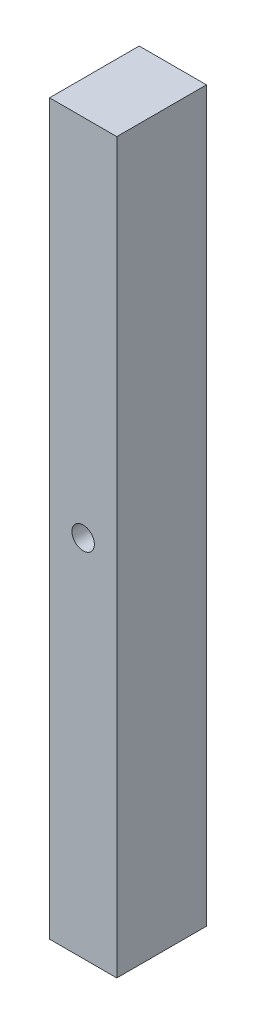
ISO-10303-21;
HEADER;
FILE_DESCRIPTION(('STEP AP214'),'2;1');
FILE_NAME('part.step','',(''),(''),'','','');
FILE_SCHEMA(('AUTOMOTIVE_DESIGN { 1 0 10303 214 1 1 1 1 }'));
ENDSEC;
DATA;
#1=APPLICATION_CONTEXT('core data for automotive mechanical design processes');
#2=APPLICATION_PROTOCOL_DEFINITION('international standard','automotive_design',2000,#1);
#3=PRODUCT_CONTEXT('',#1,'mechanical');
#4=PRODUCT('Part','Part','',(#3));
#5=PRODUCT_RELATED_PRODUCT_CATEGORY('part','',(#4));
#6=PRODUCT_DEFINITION_FORMATION('','',#4);
#7=PRODUCT_DEFINITION_CONTEXT('part definition',#1,'design');
#8=PRODUCT_DEFINITION('design','',#6,#7);
#9=PRODUCT_DEFINITION_SHAPE('','',#8);
#10=(LENGTH_UNIT() NAMED_UNIT(*) SI_UNIT(.MILLI.,.METRE.));
#11=(NAMED_UNIT(*) PLANE_ANGLE_UNIT() SI_UNIT($,.RADIAN.));
#12=(NAMED_UNIT(*) SI_UNIT($,.STERADIAN.) SOLID_ANGLE_UNIT());
#13=UNCERTAINTY_MEASURE_WITH_UNIT(LENGTH_MEASURE(1.E-05),#10,'distance_accuracy_value','');
#14=(GEOMETRIC_REPRESENTATION_CONTEXT(3) GLOBAL_UNCERTAINTY_ASSIGNED_CONTEXT((#13)) GLOBAL_UNIT_ASSIGNED_CONTEXT((#10,
#11,#12)) REPRESENTATION_CONTEXT('',''));
#15=CARTESIAN_POINT('',(0.,0.,0.));
#16=DIRECTION('',(0.,0.,1.));
#17=DIRECTION('',(1.,0.,0.));
#18=AXIS2_PLACEMENT_3D('',#15,#16,#17);
#19=CARTESIAN_POINT('',(0.,0.,8.));
#20=DIRECTION('',(0.,0.,1.));
#21=DIRECTION('',(1.,0.,0.));
#22=AXIS2_PLACEMENT_3D('',#19,#20,#21);
#23=PLANE('',#22);
#24=DIRECTION('',(0.,1.,0.));
#25=VECTOR('',#24,1.);
#26=CARTESIAN_POINT('',(4.31122448979592,-11.9387755102041,8.));
#27=LINE('',#26,#25);
#28=CARTESIAN_POINT('',(4.31122448979592,-11.9387755102041,8.));
#29=VERTEX_POINT('',#28);
#30=CARTESIAN_POINT('',(4.31122448979592,53.0612244897959,8.));
#31=VERTEX_POINT('',#30);
#32=EDGE_CURVE('E85',#29,#31,#27,.T.);
#33=ORIENTED_EDGE('',*,*,#32,.T.);
#34=DIRECTION('',(-1.,0.,0.));
#35=VECTOR('',#34,1.);
#36=CARTESIAN_POINT('',(4.31122448979592,53.0612244897959,8.));
#37=LINE('',#36,#35);
#38=CARTESIAN_POINT('',(-1.68877551020408,53.0612244897959,8.));
#39=VERTEX_POINT('',#38);
#40=EDGE_CURVE('E80',#31,#39,#37,.T.);
#41=ORIENTED_EDGE('',*,*,#40,.T.);
#42=DIRECTION('',(0.,-1.,0.));
#43=VECTOR('',#42,1.);
#44=CARTESIAN_POINT('',(-1.68877551020408,-11.9387755102041,8.));
#45=LINE('',#44,#43);
#46=CARTESIAN_POINT('',(-1.68877551020408,-11.9387755102041,8.));
#47=VERTEX_POINT('',#46);
#48=EDGE_CURVE('E83',#39,#47,#45,.T.);
#49=ORIENTED_EDGE('',*,*,#48,.T.);
#50=DIRECTION('',(1.,0.,0.));
#51=VECTOR('',#50,1.);
#52=CARTESIAN_POINT('',(4.31122448979592,-11.9387755102041,8.));
#53=LINE('',#52,#51);
#54=EDGE_CURVE('E50',#47,#29,#53,.T.);
#55=ORIENTED_EDGE('',*,*,#54,.T.);
#56=EDGE_LOOP('',(#33,#41,#49,#55));
#57=FACE_BOUND('',#56,.T.);
#58=CARTESIAN_POINT('',(1.31122448979592,20.5612244897959,8.));
#59=DIRECTION('',(0.,0.,1.));
#60=DIRECTION('',(1.,0.,0.));
#61=AXIS2_PLACEMENT_3D('',#58,#59,#60);
#62=CIRCLE('',#61,1.);
#63=CARTESIAN_POINT('',(2.31122448979593,20.5612244897959,8.));
#64=VERTEX_POINT('',#63);
#65=EDGE_CURVE('E100',#64,#64,#62,.T.);
#66=ORIENTED_EDGE('',*,*,#65,.F.);
#67=EDGE_LOOP('',(#66));
#68=FACE_BOUND('',#67,.T.);
#69=ADVANCED_FACE('F33',(#57,#68),#23,.T.);
#70=CARTESIAN_POINT('',(0.,0.,0.));
#71=DIRECTION('',(0.,0.,1.));
#72=DIRECTION('',(1.,0.,0.));
#73=AXIS2_PLACEMENT_3D('',#70,#71,#72);
#74=PLANE('',#73);
#75=DIRECTION('',(0.,1.,0.));
#76=VECTOR('',#75,1.);
#77=CARTESIAN_POINT('',(4.31122448979592,-11.9387755102041,0.));
#78=LINE('',#77,#76);
#79=CARTESIAN_POINT('',(4.31122448979592,-11.9387755102041,0.));
#80=VERTEX_POINT('',#79);
#81=CARTESIAN_POINT('',(4.31122448979592,53.0612244897959,0.));
#82=VERTEX_POINT('',#81);
#83=EDGE_CURVE('E97',#80,#82,#78,.T.);
#84=ORIENTED_EDGE('',*,*,#83,.F.);
#85=DIRECTION('',(1.,0.,0.));
#86=VECTOR('',#85,1.);
#87=CARTESIAN_POINT('',(4.31122448979592,-11.9387755102041,0.));
#88=LINE('',#87,#86);
#89=CARTESIAN_POINT('',(-1.68877551020408,-11.9387755102041,0.));
#90=VERTEX_POINT('',#89);
#91=EDGE_CURVE('E73',#90,#80,#88,.T.);
#92=ORIENTED_EDGE('',*,*,#91,.F.);
#93=DIRECTION('',(0.,-1.,0.));
#94=VECTOR('',#93,1.);
#95=CARTESIAN_POINT('',(-1.68877551020408,-11.9387755102041,0.));
#96=LINE('',#95,#94);
#97=CARTESIAN_POINT('',(-1.68877551020408,53.0612244897959,0.));
#98=VERTEX_POINT('',#97);
#99=EDGE_CURVE('E67',#98,#90,#96,.T.);
#100=ORIENTED_EDGE('',*,*,#99,.F.);
#101=DIRECTION('',(-1.,0.,0.));
#102=VECTOR('',#101,1.);
#103=CARTESIAN_POINT('',(4.31122448979592,53.0612244897959,0.));
#104=LINE('',#103,#102);
#105=EDGE_CURVE('E89',#82,#98,#104,.T.);
#106=ORIENTED_EDGE('',*,*,#105,.F.);
#107=EDGE_LOOP('',(#84,#92,#100,#106));
#108=FACE_BOUND('',#107,.T.);
#109=CARTESIAN_POINT('',(1.31122448979592,20.5612244897959,0.));
#110=DIRECTION('',(0.,0.,1.));
#111=DIRECTION('',(1.,0.,0.));
#112=AXIS2_PLACEMENT_3D('',#109,#110,#111);
#113=CIRCLE('',#112,1.);
#114=CARTESIAN_POINT('',(2.31122448979593,20.5612244897959,0.));
#115=VERTEX_POINT('',#114);
#116=EDGE_CURVE('E112',#115,#115,#113,.T.);
#117=ORIENTED_EDGE('',*,*,#116,.T.);
#118=EDGE_LOOP('',(#117));
#119=FACE_BOUND('',#118,.T.);
#120=ADVANCED_FACE('F108',(#108,#119),#74,.F.);
#121=CARTESIAN_POINT('',(4.31122448979592,-11.9387755102041,8.));
#122=DIRECTION('',(-1.,0.,0.));
#123=DIRECTION('',(0.,0.,1.));
#124=AXIS2_PLACEMENT_3D('',#121,#122,#123);
#125=PLANE('',#124);
#126=ORIENTED_EDGE('',*,*,#83,.T.);
#127=DIRECTION('',(0.,0.,-1.));
#128=VECTOR('',#127,1.);
#129=CARTESIAN_POINT('',(4.31122448979592,53.0612244897959,8.));
#130=LINE('',#129,#128);
#131=EDGE_CURVE('E11',#31,#82,#130,.T.);
#132=ORIENTED_EDGE('',*,*,#131,.F.);
#133=ORIENTED_EDGE('',*,*,#32,.F.);
#134=DIRECTION('',(0.,0.,-1.));
#135=VECTOR('',#134,1.);
#136=CARTESIAN_POINT('',(4.31122448979592,-11.9387755102041,8.));
#137=LINE('',#136,#135);
#138=EDGE_CURVE('E93',#29,#80,#137,.T.);
#139=ORIENTED_EDGE('',*,*,#138,.T.);
#140=EDGE_LOOP('',(#126,#132,#133,#139));
#141=FACE_BOUND('',#140,.T.);
#142=ADVANCED_FACE('F35',(#141),#125,.F.);
#143=CARTESIAN_POINT('',(4.31122448979592,53.0612244897959,8.));
#144=DIRECTION('',(0.,-1.,0.));
#145=DIRECTION('',(0.,0.,-1.));
#146=AXIS2_PLACEMENT_3D('',#143,#144,#145);
#147=PLANE('',#146);
#148=ORIENTED_EDGE('',*,*,#105,.T.);
#149=DIRECTION('',(0.,0.,-1.));
#150=VECTOR('',#149,1.);
#151=CARTESIAN_POINT('',(-1.68877551020408,53.0612244897959,8.));
#152=LINE('',#151,#150);
#153=EDGE_CURVE('E42',#39,#98,#152,.T.);
#154=ORIENTED_EDGE('',*,*,#153,.F.);
#155=ORIENTED_EDGE('',*,*,#40,.F.);
#156=ORIENTED_EDGE('',*,*,#131,.T.);
#157=EDGE_LOOP('',(#148,#154,#155,#156));
#158=FACE_BOUND('',#157,.T.);
#159=ADVANCED_FACE('F88',(#158),#147,.F.);
#160=CARTESIAN_POINT('',(-1.68877551020408,-11.9387755102041,8.));
#161=DIRECTION('',(1.,0.,0.));
#162=DIRECTION('',(0.,0.,-1.));
#163=AXIS2_PLACEMENT_3D('',#160,#161,#162);
#164=PLANE('',#163);
#165=ORIENTED_EDGE('',*,*,#99,.T.);
#166=DIRECTION('',(0.,0.,-1.));
#167=VECTOR('',#166,1.);
#168=CARTESIAN_POINT('',(-1.68877551020408,-11.9387755102041,8.));
#169=LINE('',#168,#167);
#170=EDGE_CURVE('E90',#47,#90,#169,.T.);
#171=ORIENTED_EDGE('',*,*,#170,.F.);
#172=ORIENTED_EDGE('',*,*,#48,.F.);
#173=ORIENTED_EDGE('',*,*,#153,.T.);
#174=EDGE_LOOP('',(#165,#171,#172,#173));
#175=FACE_BOUND('',#174,.T.);
#176=ADVANCED_FACE('F91',(#175),#164,.F.);
#177=CARTESIAN_POINT('',(4.31122448979592,-11.9387755102041,8.));
#178=DIRECTION('',(0.,1.,0.));
#179=DIRECTION('',(0.,0.,1.));
#180=AXIS2_PLACEMENT_3D('',#177,#178,#179);
#181=PLANE('',#180);
#182=ORIENTED_EDGE('',*,*,#91,.T.);
#183=ORIENTED_EDGE('',*,*,#138,.F.);
#184=ORIENTED_EDGE('',*,*,#54,.F.);
#185=ORIENTED_EDGE('',*,*,#170,.T.);
#186=EDGE_LOOP('',(#182,#183,#184,#185));
#187=FACE_BOUND('',#186,.T.);
#188=ADVANCED_FACE('F105',(#187),#181,.F.);
#189=CARTESIAN_POINT('',(1.31122448979592,20.5612244897959,8.));
#190=DIRECTION('',(0.,0.,-1.));
#191=DIRECTION('',(-1.,0.,0.));
#192=AXIS2_PLACEMENT_3D('',#189,#190,#191);
#193=CYLINDRICAL_SURFACE('',#192,1.);
#194=ORIENTED_EDGE('',*,*,#65,.T.);
#195=EDGE_LOOP('',(#194));
#196=FACE_BOUND('',#195,.T.);
#197=ORIENTED_EDGE('',*,*,#116,.F.);
#198=EDGE_LOOP('',(#197));
#199=FACE_BOUND('',#198,.T.);
#200=ADVANCED_FACE('F118',(#196,#199),#193,.F.);
#201=CLOSED_SHELL('',(#69,#120,#142,#159,#176,#188,#200));
#202=MANIFOLD_SOLID_BREP('B2',#201);
#203=ADVANCED_BREP_SHAPE_REPRESENTATION('',(#18,#202),#14);
#204=SHAPE_DEFINITION_REPRESENTATION(#9,#203);
ENDSEC;
END-ISO-10303-21;
